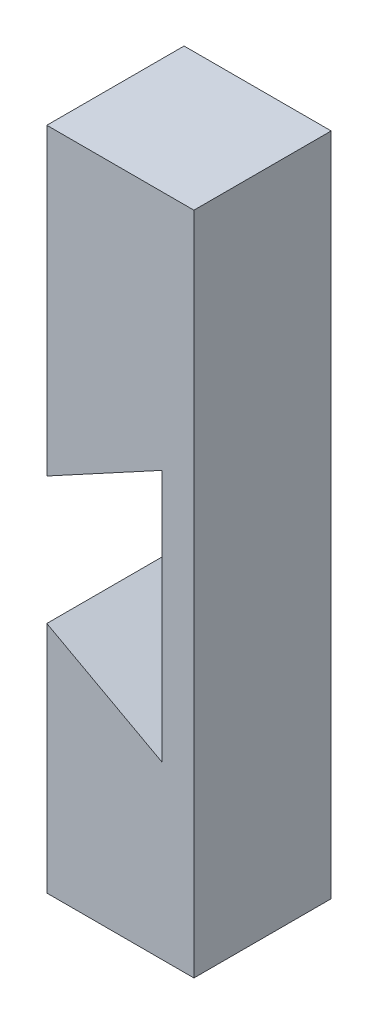
ISO-10303-21;
HEADER;
FILE_DESCRIPTION(('STEP AP214'),'2;1');
FILE_NAME('part.step','',(''),(''),'','','');
FILE_SCHEMA(('AUTOMOTIVE_DESIGN { 1 0 10303 214 1 1 1 1 }'));
ENDSEC;
DATA;
#1=APPLICATION_CONTEXT('core data for automotive mechanical design processes');
#2=APPLICATION_PROTOCOL_DEFINITION('international standard','automotive_design',2000,#1);
#3=PRODUCT_CONTEXT('',#1,'mechanical');
#4=PRODUCT('Part','Part','',(#3));
#5=PRODUCT_RELATED_PRODUCT_CATEGORY('part','',(#4));
#6=PRODUCT_DEFINITION_FORMATION('','',#4);
#7=PRODUCT_DEFINITION_CONTEXT('part definition',#1,'design');
#8=PRODUCT_DEFINITION('design','',#6,#7);
#9=PRODUCT_DEFINITION_SHAPE('','',#8);
#10=(LENGTH_UNIT() NAMED_UNIT(*) SI_UNIT(.MILLI.,.METRE.));
#11=(NAMED_UNIT(*) PLANE_ANGLE_UNIT() SI_UNIT($,.RADIAN.));
#12=(NAMED_UNIT(*) SI_UNIT($,.STERADIAN.) SOLID_ANGLE_UNIT());
#13=UNCERTAINTY_MEASURE_WITH_UNIT(LENGTH_MEASURE(1.E-05),#10,'distance_accuracy_value','');
#14=(GEOMETRIC_REPRESENTATION_CONTEXT(3) GLOBAL_UNCERTAINTY_ASSIGNED_CONTEXT((#13)) GLOBAL_UNIT_ASSIGNED_CONTEXT((#10,
#11,#12)) REPRESENTATION_CONTEXT('',''));
#15=CARTESIAN_POINT('',(0.,0.,0.));
#16=DIRECTION('',(0.,0.,1.));
#17=DIRECTION('',(1.,0.,0.));
#18=AXIS2_PLACEMENT_3D('',#15,#16,#17);
#19=CARTESIAN_POINT('',(134.046291351817,0.,0.));
#20=DIRECTION('',(-1.,0.,0.));
#21=DIRECTION('',(0.,0.,1.));
#22=AXIS2_PLACEMENT_3D('',#19,#20,#21);
#23=PLANE('',#22);
#24=CARTESIAN_POINT('',(134.046291351817,12.2674593439969,-107.395622135635));
#25=DIRECTION('',(-1.,0.,0.));
#26=DIRECTION('',(0.,0.,1.));
#27=AXIS2_PLACEMENT_3D('',#24,#25,#26);
#28=CIRCLE('',#27,3.1);
#29=CARTESIAN_POINT('',(134.046291351817,12.2674593439969,-104.295622135635));
#30=VERTEX_POINT('',#29);
#31=EDGE_CURVE('E128',#30,#30,#28,.T.);
#32=ORIENTED_EDGE('',*,*,#31,.T.);
#33=EDGE_LOOP('',(#32));
#34=FACE_BOUND('',#33,.T.);
#35=ADVANCED_FACE('F54',(#34),#23,.T.);
#36=CARTESIAN_POINT('',(134.046291351817,54.7213946055471,-107.395622135635));
#37=DIRECTION('',(-1.,0.,0.));
#38=DIRECTION('',(0.,0.,1.));
#39=AXIS2_PLACEMENT_3D('',#36,#37,#38);
#40=PLANE('',#39);
#41=CARTESIAN_POINT('',(134.046291351817,54.7213946055471,-107.395622135635));
#42=DIRECTION('',(-1.,0.,0.));
#43=DIRECTION('',(0.,0.,1.));
#44=AXIS2_PLACEMENT_3D('',#41,#42,#43);
#45=CIRCLE('',#44,3.1);
#46=CARTESIAN_POINT('',(134.046291351817,54.7213946055471,-104.295622135635));
#47=VERTEX_POINT('',#46);
#48=EDGE_CURVE('E183',#47,#47,#45,.T.);
#49=ORIENTED_EDGE('',*,*,#48,.T.);
#50=EDGE_LOOP('',(#49));
#51=FACE_BOUND('',#50,.T.);
#52=ADVANCED_FACE('F250',(#51),#40,.T.);
#53=CARTESIAN_POINT('',(134.046291351817,12.2674593439969,-107.395622135635));
#54=DIRECTION('',(-1.,0.,0.));
#55=DIRECTION('',(0.,0.,1.));
#56=AXIS2_PLACEMENT_3D('',#53,#54,#55);
#57=CYLINDRICAL_SURFACE('',#56,3.1);
#58=ORIENTED_EDGE('',*,*,#31,.F.);
#59=EDGE_LOOP('',(#58));
#60=FACE_BOUND('',#59,.T.);
#61=CARTESIAN_POINT('',(130.896291351817,12.2674593439969,-107.395622135635));
#62=DIRECTION('',(-1.,0.,0.));
#63=DIRECTION('',(0.,0.,1.));
#64=AXIS2_PLACEMENT_3D('',#61,#62,#63);
#65=CIRCLE('',#64,3.1);
#66=CARTESIAN_POINT('',(130.896291351817,12.2674593439969,-104.295622135635));
#67=VERTEX_POINT('',#66);
#68=EDGE_CURVE('E178',#67,#67,#65,.T.);
#69=ORIENTED_EDGE('',*,*,#68,.T.);
#70=EDGE_LOOP('',(#69));
#71=FACE_BOUND('',#70,.T.);
#72=ADVANCED_FACE('F256',(#60,#71),#57,.F.);
#73=CARTESIAN_POINT('',(134.046291351817,54.7213946055471,-107.395622135635));
#74=DIRECTION('',(-1.,0.,0.));
#75=DIRECTION('',(0.,0.,1.));
#76=AXIS2_PLACEMENT_3D('',#73,#74,#75);
#77=CYLINDRICAL_SURFACE('',#76,3.1);
#78=ORIENTED_EDGE('',*,*,#48,.F.);
#79=EDGE_LOOP('',(#78));
#80=FACE_BOUND('',#79,.T.);
#81=CARTESIAN_POINT('',(130.896291351817,54.7213946055471,-107.395622135635));
#82=DIRECTION('',(-1.,0.,0.));
#83=DIRECTION('',(0.,0.,1.));
#84=AXIS2_PLACEMENT_3D('',#81,#82,#83);
#85=CIRCLE('',#84,3.1);
#86=CARTESIAN_POINT('',(130.896291351817,54.7213946055471,-104.295622135635));
#87=VERTEX_POINT('',#86);
#88=EDGE_CURVE('E182',#87,#87,#85,.T.);
#89=ORIENTED_EDGE('',*,*,#88,.T.);
#90=EDGE_LOOP('',(#89));
#91=FACE_BOUND('',#90,.T.);
#92=ADVANCED_FACE('F261',(#80,#91),#77,.F.);
#93=CARTESIAN_POINT('',(142.996381437181,18.0143801043625,-115.01));
#94=DIRECTION('',(-0.476903884965481,-0.878955450807851,0.));
#95=DIRECTION('',(0.878955450807851,-0.476903884965481,0.));
#96=AXIS2_PLACEMENT_3D('',#93,#94,#95);
#97=PLANE('',#96);
#98=DIRECTION('',(0.,0.,1.));
#99=VECTOR('',#98,1.);
#100=CARTESIAN_POINT('',(130.896291351817,24.5796502381768,-115.01));
#101=LINE('',#100,#99);
#102=CARTESIAN_POINT('',(130.896291351817,24.5796502381768,-115.));
#103=VERTEX_POINT('',#102);
#104=CARTESIAN_POINT('',(130.896291351817,24.5796502381768,-100.550503360694));
#105=VERTEX_POINT('',#104);
#106=EDGE_CURVE('E157',#103,#105,#101,.T.);
#107=ORIENTED_EDGE('',*,*,#106,.T.);
#108=DIRECTION('',(0.878955450807851,-0.476903884965481,0.));
#109=VECTOR('',#108,1.);
#110=CARTESIAN_POINT('',(142.996381437181,18.0143801043625,-100.550503360694));
#111=LINE('',#110,#109);
#112=CARTESIAN_POINT('',(142.996381437181,18.0143801043625,-100.550503360694));
#113=VERTEX_POINT('',#112);
#114=EDGE_CURVE('E122',#105,#113,#111,.T.);
#115=ORIENTED_EDGE('',*,*,#114,.T.);
#116=DIRECTION('',(0.,0.,1.));
#117=VECTOR('',#116,1.);
#118=CARTESIAN_POINT('',(142.996381437181,18.0143801043625,-115.01));
#119=LINE('',#118,#117);
#120=CARTESIAN_POINT('',(142.996381437181,18.0143801043625,-115.));
#121=VERTEX_POINT('',#120);
#122=EDGE_CURVE('E156',#121,#113,#119,.T.);
#123=ORIENTED_EDGE('',*,*,#122,.F.);
#124=DIRECTION('',(-0.878955450807851,0.476903884965481,0.));
#125=VECTOR('',#124,1.);
#126=CARTESIAN_POINT('',(6.63873883922035,91.9993465095802,-115.));
#127=LINE('',#126,#125);
#128=EDGE_CURVE('E168',#121,#103,#127,.T.);
#129=ORIENTED_EDGE('',*,*,#128,.T.);
#130=EDGE_LOOP('',(#107,#115,#123,#129));
#131=FACE_BOUND('',#130,.T.);
#132=ADVANCED_FACE('F234',(#131),#97,.F.);
#133=CARTESIAN_POINT('',(142.996381437181,44.5862853397348,-115.01));
#134=DIRECTION('',(1.,0.,0.));
#135=DIRECTION('',(0.,0.,-1.));
#136=AXIS2_PLACEMENT_3D('',#133,#134,#135);
#137=PLANE('',#136);
#138=ORIENTED_EDGE('',*,*,#122,.T.);
#139=DIRECTION('',(0.,1.,0.));
#140=VECTOR('',#139,1.);
#141=CARTESIAN_POINT('',(142.996381437181,44.5862853397348,-100.550503360694));
#142=LINE('',#141,#140);
#143=CARTESIAN_POINT('',(142.996381437181,44.5862853397348,-100.550503360694));
#144=VERTEX_POINT('',#143);
#145=EDGE_CURVE('E218',#113,#144,#142,.T.);
#146=ORIENTED_EDGE('',*,*,#145,.T.);
#147=DIRECTION('',(0.,0.,1.));
#148=VECTOR('',#147,1.);
#149=CARTESIAN_POINT('',(142.996381437181,44.5862853397348,-115.01));
#150=LINE('',#149,#148);
#151=CARTESIAN_POINT('',(142.996381437181,44.5862853397348,-115.));
#152=VERTEX_POINT('',#151);
#153=EDGE_CURVE('E150',#152,#144,#150,.T.);
#154=ORIENTED_EDGE('',*,*,#153,.F.);
#155=DIRECTION('',(0.,-1.,0.));
#156=VECTOR('',#155,1.);
#157=CARTESIAN_POINT('',(142.996381437181,70.,-115.));
#158=LINE('',#157,#156);
#159=EDGE_CURVE('E154',#152,#121,#158,.T.);
#160=ORIENTED_EDGE('',*,*,#159,.T.);
#161=EDGE_LOOP('',(#138,#146,#154,#160));
#162=FACE_BOUND('',#161,.T.);
#163=ADVANCED_FACE('F276',(#162),#137,.F.);
#164=CARTESIAN_POINT('',(142.996381437181,44.5862853397348,-115.01));
#165=DIRECTION('',(-0.476903884965473,0.878955450807854,0.));
#166=DIRECTION('',(-0.878955450807854,-0.476903884965473,0.));
#167=AXIS2_PLACEMENT_3D('',#164,#165,#166);
#168=PLANE('',#167);
#169=ORIENTED_EDGE('',*,*,#153,.T.);
#170=DIRECTION('',(-0.878955450807854,-0.476903884965473,0.));
#171=VECTOR('',#170,1.);
#172=CARTESIAN_POINT('',(142.996381437181,44.5862853397348,-100.550503360694));
#173=LINE('',#172,#171);
#174=CARTESIAN_POINT('',(130.896291351817,38.0210152059206,-100.550503360694));
#175=VERTEX_POINT('',#174);
#176=EDGE_CURVE('E214',#144,#175,#173,.T.);
#177=ORIENTED_EDGE('',*,*,#176,.T.);
#178=DIRECTION('',(0.,0.,1.));
#179=VECTOR('',#178,1.);
#180=CARTESIAN_POINT('',(130.896291351817,38.0210152059206,-115.01));
#181=LINE('',#180,#179);
#182=CARTESIAN_POINT('',(130.896291351817,38.0210152059206,-115.));
#183=VERTEX_POINT('',#182);
#184=EDGE_CURVE('E148',#183,#175,#181,.T.);
#185=ORIENTED_EDGE('',*,*,#184,.F.);
#186=DIRECTION('',(0.878955450807854,0.476903884965473,0.));
#187=VECTOR('',#186,1.);
#188=CARTESIAN_POINT('',(39.0827805364029,-11.7951841929755,-115.));
#189=LINE('',#188,#187);
#190=EDGE_CURVE('E162',#183,#152,#189,.T.);
#191=ORIENTED_EDGE('',*,*,#190,.T.);
#192=EDGE_LOOP('',(#169,#177,#185,#191));
#193=FACE_BOUND('',#192,.T.);
#194=ADVANCED_FACE('F213',(#193),#168,.F.);
#195=CARTESIAN_POINT('',(130.896291351817,-0.0543782899306134,-115.01));
#196=DIRECTION('',(1.,0.,0.));
#197=DIRECTION('',(0.,1.,0.));
#198=AXIS2_PLACEMENT_3D('',#195,#196,#197);
#199=PLANE('',#198);
#200=ORIENTED_EDGE('',*,*,#68,.F.);
#201=EDGE_LOOP('',(#200));
#202=FACE_BOUND('',#201,.T.);
#203=DIRECTION('',(0.,0.,1.));
#204=VECTOR('',#203,1.);
#205=CARTESIAN_POINT('',(130.896291351817,0.,0.));
#206=LINE('',#205,#204);
#207=CARTESIAN_POINT('',(130.896291351817,0.,-115.));
#208=VERTEX_POINT('',#207);
#209=CARTESIAN_POINT('',(130.896291351817,0.,-100.550503360694));
#210=VERTEX_POINT('',#209);
#211=EDGE_CURVE('E134',#208,#210,#206,.T.);
#212=ORIENTED_EDGE('',*,*,#211,.T.);
#213=DIRECTION('',(0.,1.,0.));
#214=VECTOR('',#213,1.);
#215=CARTESIAN_POINT('',(130.896291351817,-0.0543782899306134,-100.550503360694));
#216=LINE('',#215,#214);
#217=EDGE_CURVE('E119',#210,#105,#216,.T.);
#218=ORIENTED_EDGE('',*,*,#217,.T.);
#219=ORIENTED_EDGE('',*,*,#106,.F.);
#220=DIRECTION('',(0.,-1.,0.));
#221=VECTOR('',#220,1.);
#222=CARTESIAN_POINT('',(130.896291351818,69.9999999999999,-115.));
#223=LINE('',#222,#221);
#224=EDGE_CURVE('E140',#103,#208,#223,.T.);
#225=ORIENTED_EDGE('',*,*,#224,.T.);
#226=EDGE_LOOP('',(#212,#218,#219,#225));
#227=FACE_BOUND('',#226,.T.);
#228=ADVANCED_FACE('F139',(#202,#227),#199,.F.);
#229=CARTESIAN_POINT('',(130.896291351817,38.0210152059206,-115.01));
#230=DIRECTION('',(1.,0.,0.));
#231=DIRECTION('',(0.,0.,-1.));
#232=AXIS2_PLACEMENT_3D('',#229,#230,#231);
#233=PLANE('',#232);
#234=ORIENTED_EDGE('',*,*,#88,.F.);
#235=EDGE_LOOP('',(#234));
#236=FACE_BOUND('',#235,.T.);
#237=ORIENTED_EDGE('',*,*,#184,.T.);
#238=DIRECTION('',(0.,1.,0.));
#239=VECTOR('',#238,1.);
#240=CARTESIAN_POINT('',(130.896291351817,38.0210152059206,-100.550503360694));
#241=LINE('',#240,#239);
#242=CARTESIAN_POINT('',(130.896291351817,70.,-100.550503360694));
#243=VERTEX_POINT('',#242);
#244=EDGE_CURVE('E209',#175,#243,#241,.T.);
#245=ORIENTED_EDGE('',*,*,#244,.T.);
#246=DIRECTION('',(0.,0.,1.));
#247=VECTOR('',#246,1.);
#248=CARTESIAN_POINT('',(130.896291351817,70.,0.));
#249=LINE('',#248,#247);
#250=CARTESIAN_POINT('',(130.896291351817,70.,-115.));
#251=VERTEX_POINT('',#250);
#252=EDGE_CURVE('E177',#251,#243,#249,.T.);
#253=ORIENTED_EDGE('',*,*,#252,.F.);
#254=DIRECTION('',(0.,-1.,0.));
#255=VECTOR('',#254,1.);
#256=CARTESIAN_POINT('',(130.896291351817,70.,-115.));
#257=LINE('',#256,#255);
#258=EDGE_CURVE('E143',#251,#183,#257,.T.);
#259=ORIENTED_EDGE('',*,*,#258,.T.);
#260=EDGE_LOOP('',(#237,#245,#253,#259));
#261=FACE_BOUND('',#260,.T.);
#262=ADVANCED_FACE('F207',(#236,#261),#233,.F.);
#263=CARTESIAN_POINT('',(0.,0.,0.));
#264=DIRECTION('',(0.,-1.,0.));
#265=DIRECTION('',(0.,0.,-1.));
#266=AXIS2_PLACEMENT_3D('',#263,#264,#265);
#267=PLANE('',#266);
#268=DIRECTION('',(1.,0.,0.));
#269=VECTOR('',#268,1.);
#270=CARTESIAN_POINT('',(130.896291351817,0.,-100.550503360694));
#271=LINE('',#270,#269);
#272=CARTESIAN_POINT('',(146.380641441796,0.,-100.550503360694));
#273=VERTEX_POINT('',#272);
#274=EDGE_CURVE('E69',#210,#273,#271,.T.);
#275=ORIENTED_EDGE('',*,*,#274,.F.);
#276=ORIENTED_EDGE('',*,*,#211,.F.);
#277=DIRECTION('',(1.,0.,0.));
#278=VECTOR('',#277,1.);
#279=CARTESIAN_POINT('',(-5.2976725084512,0.,-115.));
#280=LINE('',#279,#278);
#281=CARTESIAN_POINT('',(146.380641441796,0.,-115.));
#282=VERTEX_POINT('',#281);
#283=EDGE_CURVE('E169',#208,#282,#280,.T.);
#284=ORIENTED_EDGE('',*,*,#283,.T.);
#285=DIRECTION('',(0.,0.,-1.));
#286=VECTOR('',#285,1.);
#287=CARTESIAN_POINT('',(146.380641441796,0.,249.15));
#288=LINE('',#287,#286);
#289=EDGE_CURVE('E63',#273,#282,#288,.T.);
#290=ORIENTED_EDGE('',*,*,#289,.F.);
#291=EDGE_LOOP('',(#275,#276,#284,#290));
#292=FACE_BOUND('',#291,.T.);
#293=ADVANCED_FACE('F132',(#292),#267,.T.);
#294=CARTESIAN_POINT('',(0.,70.,0.));
#295=DIRECTION('',(0.,-1.,0.));
#296=DIRECTION('',(0.,0.,-1.));
#297=AXIS2_PLACEMENT_3D('',#294,#295,#296);
#298=PLANE('',#297);
#299=ORIENTED_EDGE('',*,*,#252,.T.);
#300=DIRECTION('',(1.,0.,0.));
#301=VECTOR('',#300,1.);
#302=CARTESIAN_POINT('',(0.,70.,-100.550503360694));
#303=LINE('',#302,#301);
#304=CARTESIAN_POINT('',(146.380641441796,70.,-100.550503360694));
#305=VERTEX_POINT('',#304);
#306=EDGE_CURVE('E137',#243,#305,#303,.T.);
#307=ORIENTED_EDGE('',*,*,#306,.T.);
#308=DIRECTION('',(0.,0.,-1.));
#309=VECTOR('',#308,1.);
#310=CARTESIAN_POINT('',(146.380641441796,70.,249.15));
#311=LINE('',#310,#309);
#312=CARTESIAN_POINT('',(146.380641441796,70.,-115.));
#313=VERTEX_POINT('',#312);
#314=EDGE_CURVE('E78',#305,#313,#311,.T.);
#315=ORIENTED_EDGE('',*,*,#314,.T.);
#316=DIRECTION('',(1.,0.,0.));
#317=VECTOR('',#316,1.);
#318=CARTESIAN_POINT('',(-5.2976725084512,70.,-115.));
#319=LINE('',#318,#317);
#320=EDGE_CURVE('E172',#251,#313,#319,.T.);
#321=ORIENTED_EDGE('',*,*,#320,.F.);
#322=EDGE_LOOP('',(#299,#307,#315,#321));
#323=FACE_BOUND('',#322,.T.);
#324=ADVANCED_FACE('F238',(#323),#298,.F.);
#325=CARTESIAN_POINT('',(-5.2976725084512,70.,-115.));
#326=DIRECTION('',(0.,0.,-1.));
#327=DIRECTION('',(-1.,0.,0.));
#328=AXIS2_PLACEMENT_3D('',#325,#326,#327);
#329=PLANE('',#328);
#330=ORIENTED_EDGE('',*,*,#320,.T.);
#331=DIRECTION('',(0.,-1.,0.));
#332=VECTOR('',#331,1.);
#333=CARTESIAN_POINT('',(146.380641441796,70.,-115.));
#334=LINE('',#333,#332);
#335=EDGE_CURVE('E176',#313,#282,#334,.T.);
#336=ORIENTED_EDGE('',*,*,#335,.T.);
#337=ORIENTED_EDGE('',*,*,#283,.F.);
#338=ORIENTED_EDGE('',*,*,#224,.F.);
#339=ORIENTED_EDGE('',*,*,#128,.F.);
#340=ORIENTED_EDGE('',*,*,#159,.F.);
#341=ORIENTED_EDGE('',*,*,#190,.F.);
#342=ORIENTED_EDGE('',*,*,#258,.F.);
#343=EDGE_LOOP('',(#330,#336,#337,#338,#339,#340,#341,#342));
#344=FACE_BOUND('',#343,.T.);
#345=ADVANCED_FACE('F236',(#344),#329,.T.);
#346=CARTESIAN_POINT('',(146.380641441796,70.,249.15));
#347=DIRECTION('',(1.,0.,0.));
#348=DIRECTION('',(0.,0.,-1.));
#349=AXIS2_PLACEMENT_3D('',#346,#347,#348);
#350=PLANE('',#349);
#351=DIRECTION('',(0.,1.,0.));
#352=VECTOR('',#351,1.);
#353=CARTESIAN_POINT('',(146.380641441796,70.,-100.550503360694));
#354=LINE('',#353,#352);
#355=EDGE_CURVE('E13',#273,#305,#354,.T.);
#356=ORIENTED_EDGE('',*,*,#355,.F.);
#357=ORIENTED_EDGE('',*,*,#289,.T.);
#358=ORIENTED_EDGE('',*,*,#335,.F.);
#359=ORIENTED_EDGE('',*,*,#314,.F.);
#360=EDGE_LOOP('',(#356,#357,#358,#359));
#361=FACE_BOUND('',#360,.T.);
#362=ADVANCED_FACE('F56',(#361),#350,.T.);
#363=CARTESIAN_POINT('',(130.896291351817,364.15,-100.550503360694));
#364=DIRECTION('',(0.,0.,-1.));
#365=DIRECTION('',(-1.,0.,0.));
#366=AXIS2_PLACEMENT_3D('',#363,#364,#365);
#367=PLANE('',#366);
#368=ORIENTED_EDGE('',*,*,#274,.T.);
#369=ORIENTED_EDGE('',*,*,#355,.T.);
#370=ORIENTED_EDGE('',*,*,#306,.F.);
#371=ORIENTED_EDGE('',*,*,#244,.F.);
#372=ORIENTED_EDGE('',*,*,#176,.F.);
#373=ORIENTED_EDGE('',*,*,#145,.F.);
#374=ORIENTED_EDGE('',*,*,#114,.F.);
#375=ORIENTED_EDGE('',*,*,#217,.F.);
#376=EDGE_LOOP('',(#368,#369,#370,#371,#372,#373,#374,#375));
#377=FACE_BOUND('',#376,.T.);
#378=ADVANCED_FACE('F120',(#377),#367,.F.);
#379=CLOSED_SHELL('',(#35,#52,#72,#92,#132,#163,#194,#228,#262,#293,#324,#345,#362,#378));
#380=MANIFOLD_SOLID_BREP('B2',#379);
#381=ADVANCED_BREP_SHAPE_REPRESENTATION('',(#18,#380),#14);
#382=SHAPE_DEFINITION_REPRESENTATION(#9,#381);
ENDSEC;
END-ISO-10303-21;
